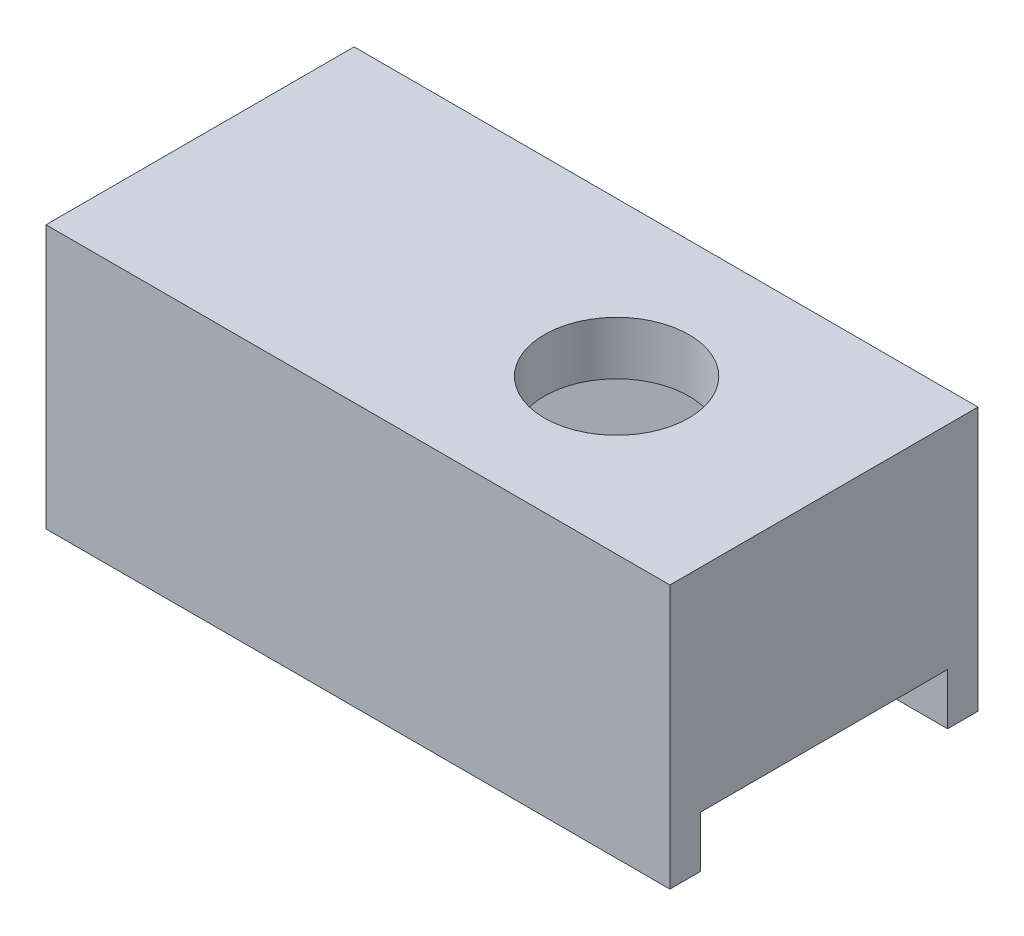
ISO-10303-21;
HEADER;
FILE_DESCRIPTION(('STEP AP214'),'2;1');
FILE_NAME('part.step','',(''),(''),'','','');
FILE_SCHEMA(('AUTOMOTIVE_DESIGN { 1 0 10303 214 1 1 1 1 }'));
ENDSEC;
DATA;
#1=APPLICATION_CONTEXT('core data for automotive mechanical design processes');
#2=APPLICATION_PROTOCOL_DEFINITION('international standard','automotive_design',2000,#1);
#3=PRODUCT_CONTEXT('',#1,'mechanical');
#4=PRODUCT('Part','Part','',(#3));
#5=PRODUCT_RELATED_PRODUCT_CATEGORY('part','',(#4));
#6=PRODUCT_DEFINITION_FORMATION('','',#4);
#7=PRODUCT_DEFINITION_CONTEXT('part definition',#1,'design');
#8=PRODUCT_DEFINITION('design','',#6,#7);
#9=PRODUCT_DEFINITION_SHAPE('','',#8);
#10=(LENGTH_UNIT() NAMED_UNIT(*) SI_UNIT(.MILLI.,.METRE.));
#11=(NAMED_UNIT(*) PLANE_ANGLE_UNIT() SI_UNIT($,.RADIAN.));
#12=(NAMED_UNIT(*) SI_UNIT($,.STERADIAN.) SOLID_ANGLE_UNIT());
#13=UNCERTAINTY_MEASURE_WITH_UNIT(LENGTH_MEASURE(1.E-05),#10,'distance_accuracy_value','');
#14=(GEOMETRIC_REPRESENTATION_CONTEXT(3) GLOBAL_UNCERTAINTY_ASSIGNED_CONTEXT((#13)) GLOBAL_UNIT_ASSIGNED_CONTEXT((#10,
#11,#12)) REPRESENTATION_CONTEXT('',''));
#15=CARTESIAN_POINT('',(0.,0.,0.));
#16=DIRECTION('',(0.,0.,1.));
#17=DIRECTION('',(1.,0.,0.));
#18=AXIS2_PLACEMENT_3D('',#15,#16,#17);
#19=CARTESIAN_POINT('',(0.,7.85,0.));
#20=DIRECTION('',(0.,-1.,0.));
#21=DIRECTION('',(0.,0.,-1.));
#22=AXIS2_PLACEMENT_3D('',#19,#20,#21);
#23=PLANE('',#22);
#24=CARTESIAN_POINT('',(-13.75,7.85,0.));
#25=DIRECTION('',(0.,-1.,0.));
#26=DIRECTION('',(0.,0.,-1.));
#27=AXIS2_PLACEMENT_3D('',#24,#25,#26);
#28=CIRCLE('',#27,0.925);
#29=CARTESIAN_POINT('',(-13.75,7.85,-0.925));
#30=VERTEX_POINT('',#29);
#31=EDGE_CURVE('E43',#30,#30,#28,.T.);
#32=ORIENTED_EDGE('',*,*,#31,.F.);
#33=EDGE_LOOP('',(#32));
#34=FACE_BOUND('',#33,.T.);
#35=DIRECTION('',(0.,0.,1.));
#36=VECTOR('',#35,1.);
#37=CARTESIAN_POINT('',(-11.7,7.85,6.5));
#38=LINE('',#37,#36);
#39=CARTESIAN_POINT('',(-11.7,7.85,-6.5));
#40=VERTEX_POINT('',#39);
#41=CARTESIAN_POINT('',(-11.7,7.85,6.5));
#42=VERTEX_POINT('',#41);
#43=EDGE_CURVE('E134',#40,#42,#38,.T.);
#44=ORIENTED_EDGE('',*,*,#43,.T.);
#45=DIRECTION('',(1.,0.,0.));
#46=VECTOR('',#45,1.);
#47=CARTESIAN_POINT('',(-16.4,7.85,6.5));
#48=LINE('',#47,#46);
#49=CARTESIAN_POINT('',(-16.4,7.85,6.5));
#50=VERTEX_POINT('',#49);
#51=EDGE_CURVE('E147',#50,#42,#48,.T.);
#52=ORIENTED_EDGE('',*,*,#51,.F.);
#53=DIRECTION('',(0.,0.,1.));
#54=VECTOR('',#53,1.);
#55=CARTESIAN_POINT('',(-16.4,7.85,6.5));
#56=LINE('',#55,#54);
#57=CARTESIAN_POINT('',(-16.4,7.85,-6.5));
#58=VERTEX_POINT('',#57);
#59=EDGE_CURVE('E164',#58,#50,#56,.T.);
#60=ORIENTED_EDGE('',*,*,#59,.F.);
#61=DIRECTION('',(-1.,0.,0.));
#62=VECTOR('',#61,1.);
#63=CARTESIAN_POINT('',(-16.4,7.85,-6.5));
#64=LINE('',#63,#62);
#65=EDGE_CURVE('E149',#40,#58,#64,.T.);
#66=ORIENTED_EDGE('',*,*,#65,.F.);
#67=EDGE_LOOP('',(#44,#52,#60,#66));
#68=FACE_BOUND('',#67,.T.);
#69=ADVANCED_FACE('F39',(#34,#68),#23,.T.);
#70=CARTESIAN_POINT('',(0.,5.15,0.));
#71=DIRECTION('',(0.,-1.,0.));
#72=DIRECTION('',(0.,0.,-1.));
#73=AXIS2_PLACEMENT_3D('',#70,#71,#72);
#74=PLANE('',#73);
#75=DIRECTION('',(-1.,0.,0.));
#76=VECTOR('',#75,1.);
#77=CARTESIAN_POINT('',(-16.4,5.15,-6.5));
#78=LINE('',#77,#76);
#79=CARTESIAN_POINT('',(16.4,5.15,-6.5));
#80=VERTEX_POINT('',#79);
#81=CARTESIAN_POINT('',(-16.4,5.15,-6.5));
#82=VERTEX_POINT('',#81);
#83=EDGE_CURVE('E185',#80,#82,#78,.T.);
#84=ORIENTED_EDGE('',*,*,#83,.T.);
#85=DIRECTION('',(0.,0.,1.));
#86=VECTOR('',#85,1.);
#87=CARTESIAN_POINT('',(-16.4,5.15,8.1));
#88=LINE('',#87,#86);
#89=CARTESIAN_POINT('',(-16.4,5.15,-8.1));
#90=VERTEX_POINT('',#89);
#91=EDGE_CURVE('E201',#90,#82,#88,.T.);
#92=ORIENTED_EDGE('',*,*,#91,.F.);
#93=DIRECTION('',(-1.,0.,0.));
#94=VECTOR('',#93,1.);
#95=CARTESIAN_POINT('',(-16.4,5.15,-8.1));
#96=LINE('',#95,#94);
#97=CARTESIAN_POINT('',(16.4,5.15,-8.1));
#98=VERTEX_POINT('',#97);
#99=EDGE_CURVE('E191',#98,#90,#96,.T.);
#100=ORIENTED_EDGE('',*,*,#99,.F.);
#101=DIRECTION('',(0.,0.,-1.));
#102=VECTOR('',#101,1.);
#103=CARTESIAN_POINT('',(16.4,5.15,8.1));
#104=LINE('',#103,#102);
#105=EDGE_CURVE('E208',#80,#98,#104,.T.);
#106=ORIENTED_EDGE('',*,*,#105,.F.);
#107=EDGE_LOOP('',(#84,#92,#100,#106));
#108=FACE_BOUND('',#107,.T.);
#109=ADVANCED_FACE('F278',(#108),#74,.T.);
#110=CARTESIAN_POINT('',(-16.4,19.,8.1));
#111=DIRECTION('',(1.,0.,0.));
#112=DIRECTION('',(0.,0.,-1.));
#113=AXIS2_PLACEMENT_3D('',#110,#111,#112);
#114=PLANE('',#113);
#115=ORIENTED_EDGE('',*,*,#91,.T.);
#116=DIRECTION('',(0.,1.,0.));
#117=VECTOR('',#116,1.);
#118=CARTESIAN_POINT('',(-16.4,5.15,-6.5));
#119=LINE('',#118,#117);
#120=EDGE_CURVE('E173',#82,#58,#119,.T.);
#121=ORIENTED_EDGE('',*,*,#120,.T.);
#122=ORIENTED_EDGE('',*,*,#59,.T.);
#123=DIRECTION('',(0.,1.,0.));
#124=VECTOR('',#123,1.);
#125=CARTESIAN_POINT('',(-16.4,5.15,6.5));
#126=LINE('',#125,#124);
#127=CARTESIAN_POINT('',(-16.4,5.15,6.5));
#128=VERTEX_POINT('',#127);
#129=EDGE_CURVE('E155',#128,#50,#126,.T.);
#130=ORIENTED_EDGE('',*,*,#129,.F.);
#131=CARTESIAN_POINT('',(-16.4,5.15,8.1));
#132=VERTEX_POINT('',#131);
#133=EDGE_CURVE('E177',#128,#132,#88,.T.);
#134=ORIENTED_EDGE('',*,*,#133,.T.);
#135=DIRECTION('',(0.,-1.,0.));
#136=VECTOR('',#135,1.);
#137=CARTESIAN_POINT('',(-16.4,19.,8.1));
#138=LINE('',#137,#136);
#139=CARTESIAN_POINT('',(-16.4,19.,8.1));
#140=VERTEX_POINT('',#139);
#141=EDGE_CURVE('E11',#140,#132,#138,.T.);
#142=ORIENTED_EDGE('',*,*,#141,.F.);
#143=DIRECTION('',(0.,0.,1.));
#144=VECTOR('',#143,1.);
#145=CARTESIAN_POINT('',(-16.4,19.,8.1));
#146=LINE('',#145,#144);
#147=CARTESIAN_POINT('',(-16.4,19.,-8.1));
#148=VERTEX_POINT('',#147);
#149=EDGE_CURVE('E186',#148,#140,#146,.T.);
#150=ORIENTED_EDGE('',*,*,#149,.F.);
#151=DIRECTION('',(0.,-1.,0.));
#152=VECTOR('',#151,1.);
#153=CARTESIAN_POINT('',(-16.4,19.,-8.1));
#154=LINE('',#153,#152);
#155=EDGE_CURVE('E200',#148,#90,#154,.T.);
#156=ORIENTED_EDGE('',*,*,#155,.T.);
#157=EDGE_LOOP('',(#115,#121,#122,#130,#134,#142,#150,#156));
#158=FACE_BOUND('',#157,.T.);
#159=ADVANCED_FACE('F41',(#158),#114,.F.);
#160=CARTESIAN_POINT('',(-16.4,19.,8.1));
#161=DIRECTION('',(0.,0.,-1.));
#162=DIRECTION('',(-1.,0.,0.));
#163=AXIS2_PLACEMENT_3D('',#160,#161,#162);
#164=PLANE('',#163);
#165=DIRECTION('',(1.,0.,0.));
#166=VECTOR('',#165,1.);
#167=CARTESIAN_POINT('',(-16.4,5.15,8.1));
#168=LINE('',#167,#166);
#169=CARTESIAN_POINT('',(16.4,5.15,8.1));
#170=VERTEX_POINT('',#169);
#171=EDGE_CURVE('E205',#132,#170,#168,.T.);
#172=ORIENTED_EDGE('',*,*,#171,.T.);
#173=DIRECTION('',(0.,-1.,0.));
#174=VECTOR('',#173,1.);
#175=CARTESIAN_POINT('',(16.4,19.,8.1));
#176=LINE('',#175,#174);
#177=CARTESIAN_POINT('',(16.4,19.,8.1));
#178=VERTEX_POINT('',#177);
#179=EDGE_CURVE('E49',#178,#170,#176,.T.);
#180=ORIENTED_EDGE('',*,*,#179,.F.);
#181=DIRECTION('',(1.,0.,0.));
#182=VECTOR('',#181,1.);
#183=CARTESIAN_POINT('',(-16.4,19.,8.1));
#184=LINE('',#183,#182);
#185=EDGE_CURVE('E190',#140,#178,#184,.T.);
#186=ORIENTED_EDGE('',*,*,#185,.F.);
#187=ORIENTED_EDGE('',*,*,#141,.T.);
#188=EDGE_LOOP('',(#172,#180,#186,#187));
#189=FACE_BOUND('',#188,.T.);
#190=ADVANCED_FACE('F302',(#189),#164,.F.);
#191=CARTESIAN_POINT('',(16.4,19.,8.1));
#192=DIRECTION('',(-1.,0.,0.));
#193=DIRECTION('',(0.,0.,1.));
#194=AXIS2_PLACEMENT_3D('',#191,#192,#193);
#195=PLANE('',#194);
#196=DIRECTION('',(0.,0.,-1.));
#197=VECTOR('',#196,1.);
#198=CARTESIAN_POINT('',(16.4,7.85,6.5));
#199=LINE('',#198,#197);
#200=CARTESIAN_POINT('',(16.4,7.85,6.5));
#201=VERTEX_POINT('',#200);
#202=CARTESIAN_POINT('',(16.4,7.85,-6.5));
#203=VERTEX_POINT('',#202);
#204=EDGE_CURVE('E157',#201,#203,#199,.T.);
#205=ORIENTED_EDGE('',*,*,#204,.T.);
#206=DIRECTION('',(0.,1.,0.));
#207=VECTOR('',#206,1.);
#208=CARTESIAN_POINT('',(16.4,5.15,-6.5));
#209=LINE('',#208,#207);
#210=EDGE_CURVE('E178',#80,#203,#209,.T.);
#211=ORIENTED_EDGE('',*,*,#210,.F.);
#212=ORIENTED_EDGE('',*,*,#105,.T.);
#213=DIRECTION('',(0.,-1.,0.));
#214=VECTOR('',#213,1.);
#215=CARTESIAN_POINT('',(16.4,19.,-8.1));
#216=LINE('',#215,#214);
#217=CARTESIAN_POINT('',(16.4,19.,-8.1));
#218=VERTEX_POINT('',#217);
#219=EDGE_CURVE('E218',#218,#98,#216,.T.);
#220=ORIENTED_EDGE('',*,*,#219,.F.);
#221=DIRECTION('',(0.,0.,-1.));
#222=VECTOR('',#221,1.);
#223=CARTESIAN_POINT('',(16.4,19.,8.1));
#224=LINE('',#223,#222);
#225=EDGE_CURVE('E194',#178,#218,#224,.T.);
#226=ORIENTED_EDGE('',*,*,#225,.F.);
#227=ORIENTED_EDGE('',*,*,#179,.T.);
#228=CARTESIAN_POINT('',(16.4,5.15,6.5));
#229=VERTEX_POINT('',#228);
#230=EDGE_CURVE('E209',#170,#229,#104,.T.);
#231=ORIENTED_EDGE('',*,*,#230,.T.);
#232=DIRECTION('',(0.,1.,0.));
#233=VECTOR('',#232,1.);
#234=CARTESIAN_POINT('',(16.4,5.15,6.5));
#235=LINE('',#234,#233);
#236=EDGE_CURVE('E65',#229,#201,#235,.T.);
#237=ORIENTED_EDGE('',*,*,#236,.T.);
#238=EDGE_LOOP('',(#205,#211,#212,#220,#226,#227,#231,#237));
#239=FACE_BOUND('',#238,.T.);
#240=ADVANCED_FACE('F292',(#239),#195,.F.);
#241=CARTESIAN_POINT('',(-16.4,19.,-8.1));
#242=DIRECTION('',(0.,0.,1.));
#243=DIRECTION('',(1.,0.,0.));
#244=AXIS2_PLACEMENT_3D('',#241,#242,#243);
#245=PLANE('',#244);
#246=ORIENTED_EDGE('',*,*,#99,.T.);
#247=ORIENTED_EDGE('',*,*,#155,.F.);
#248=DIRECTION('',(-1.,0.,0.));
#249=VECTOR('',#248,1.);
#250=CARTESIAN_POINT('',(-16.4,19.,-8.1));
#251=LINE('',#250,#249);
#252=EDGE_CURVE('E197',#218,#148,#251,.T.);
#253=ORIENTED_EDGE('',*,*,#252,.F.);
#254=ORIENTED_EDGE('',*,*,#219,.T.);
#255=EDGE_LOOP('',(#246,#247,#253,#254));
#256=FACE_BOUND('',#255,.T.);
#257=ADVANCED_FACE('F288',(#256),#245,.F.);
#258=CARTESIAN_POINT('',(0.,19.,0.));
#259=DIRECTION('',(0.,-1.,0.));
#260=DIRECTION('',(0.,0.,-1.));
#261=AXIS2_PLACEMENT_3D('',#258,#259,#260);
#262=PLANE('',#261);
#263=CARTESIAN_POINT('',(5.5,19.,0.));
#264=DIRECTION('',(0.,1.,0.));
#265=DIRECTION('',(0.,0.,1.));
#266=AXIS2_PLACEMENT_3D('',#263,#264,#265);
#267=CIRCLE('',#266,3.8);
#268=CARTESIAN_POINT('',(5.5,19.,3.8));
#269=VERTEX_POINT('',#268);
#270=EDGE_CURVE('E233',#269,#269,#267,.T.);
#271=ORIENTED_EDGE('',*,*,#270,.F.);
#272=EDGE_LOOP('',(#271));
#273=FACE_BOUND('',#272,.T.);
#274=ORIENTED_EDGE('',*,*,#149,.T.);
#275=ORIENTED_EDGE('',*,*,#185,.T.);
#276=ORIENTED_EDGE('',*,*,#225,.T.);
#277=ORIENTED_EDGE('',*,*,#252,.T.);
#278=EDGE_LOOP('',(#274,#275,#276,#277));
#279=FACE_BOUND('',#278,.T.);
#280=ADVANCED_FACE('F304',(#273,#279),#262,.F.);
#281=DIRECTION('',(1.,0.,0.));
#282=VECTOR('',#281,1.);
#283=CARTESIAN_POINT('',(-16.4,5.15,6.5));
#284=LINE('',#283,#282);
#285=EDGE_CURVE('E172',#128,#229,#284,.T.);
#286=ORIENTED_EDGE('',*,*,#285,.T.);
#287=ORIENTED_EDGE('',*,*,#230,.F.);
#288=ORIENTED_EDGE('',*,*,#171,.F.);
#289=ORIENTED_EDGE('',*,*,#133,.F.);
#290=EDGE_LOOP('',(#286,#287,#288,#289));
#291=FACE_BOUND('',#290,.T.);
#292=ADVANCED_FACE('F299',(#291),#74,.T.);
#293=CARTESIAN_POINT('',(-16.4,5.15,-6.5));
#294=DIRECTION('',(0.,0.,-1.));
#295=DIRECTION('',(-1.,0.,0.));
#296=AXIS2_PLACEMENT_3D('',#293,#294,#295);
#297=PLANE('',#296);
#298=CARTESIAN_POINT('',(11.7,7.85,-6.5));
#299=VERTEX_POINT('',#298);
#300=EDGE_CURVE('E168',#203,#299,#64,.T.);
#301=ORIENTED_EDGE('',*,*,#300,.T.);
#302=DIRECTION('',(0.,1.,0.));
#303=VECTOR('',#302,1.);
#304=CARTESIAN_POINT('',(11.7,7.85,-6.5));
#305=LINE('',#304,#303);
#306=CARTESIAN_POINT('',(11.7,16.2,-6.5));
#307=VERTEX_POINT('',#306);
#308=EDGE_CURVE('E267',#299,#307,#305,.T.);
#309=ORIENTED_EDGE('',*,*,#308,.T.);
#310=DIRECTION('',(-1.,0.,0.));
#311=VECTOR('',#310,1.);
#312=CARTESIAN_POINT('',(-11.7,16.2,-6.5));
#313=LINE('',#312,#311);
#314=CARTESIAN_POINT('',(-11.7,16.2,-6.5));
#315=VERTEX_POINT('',#314);
#316=EDGE_CURVE('E151',#307,#315,#313,.T.);
#317=ORIENTED_EDGE('',*,*,#316,.T.);
#318=DIRECTION('',(0.,1.,0.));
#319=VECTOR('',#318,1.);
#320=CARTESIAN_POINT('',(-11.7,7.85,-6.5));
#321=LINE('',#320,#319);
#322=EDGE_CURVE('E264',#40,#315,#321,.T.);
#323=ORIENTED_EDGE('',*,*,#322,.F.);
#324=ORIENTED_EDGE('',*,*,#65,.T.);
#325=ORIENTED_EDGE('',*,*,#120,.F.);
#326=ORIENTED_EDGE('',*,*,#83,.F.);
#327=ORIENTED_EDGE('',*,*,#210,.T.);
#328=EDGE_LOOP('',(#301,#309,#317,#323,#324,#325,#326,#327));
#329=FACE_BOUND('',#328,.T.);
#330=ADVANCED_FACE('F312',(#329),#297,.F.);
#331=CARTESIAN_POINT('',(-16.4,5.15,6.5));
#332=DIRECTION('',(0.,0.,1.));
#333=DIRECTION('',(1.,0.,0.));
#334=AXIS2_PLACEMENT_3D('',#331,#332,#333);
#335=PLANE('',#334);
#336=ORIENTED_EDGE('',*,*,#51,.T.);
#337=DIRECTION('',(0.,1.,0.));
#338=VECTOR('',#337,1.);
#339=CARTESIAN_POINT('',(-11.7,7.85,6.5));
#340=LINE('',#339,#338);
#341=CARTESIAN_POINT('',(-11.7,16.2,6.5));
#342=VERTEX_POINT('',#341);
#343=EDGE_CURVE('E131',#42,#342,#340,.T.);
#344=ORIENTED_EDGE('',*,*,#343,.T.);
#345=DIRECTION('',(1.,0.,0.));
#346=VECTOR('',#345,1.);
#347=CARTESIAN_POINT('',(-11.7,16.2,6.5));
#348=LINE('',#347,#346);
#349=CARTESIAN_POINT('',(11.7,16.2,6.5));
#350=VERTEX_POINT('',#349);
#351=EDGE_CURVE('E254',#342,#350,#348,.T.);
#352=ORIENTED_EDGE('',*,*,#351,.T.);
#353=DIRECTION('',(0.,1.,0.));
#354=VECTOR('',#353,1.);
#355=CARTESIAN_POINT('',(11.7,7.85,6.5));
#356=LINE('',#355,#354);
#357=CARTESIAN_POINT('',(11.7,7.85,6.5));
#358=VERTEX_POINT('',#357);
#359=EDGE_CURVE('E142',#358,#350,#356,.T.);
#360=ORIENTED_EDGE('',*,*,#359,.F.);
#361=EDGE_CURVE('E158',#358,#201,#48,.T.);
#362=ORIENTED_EDGE('',*,*,#361,.T.);
#363=ORIENTED_EDGE('',*,*,#236,.F.);
#364=ORIENTED_EDGE('',*,*,#285,.F.);
#365=ORIENTED_EDGE('',*,*,#129,.T.);
#366=EDGE_LOOP('',(#336,#344,#352,#360,#362,#363,#364,#365));
#367=FACE_BOUND('',#366,.T.);
#368=ADVANCED_FACE('F153',(#367),#335,.F.);
#369=CARTESIAN_POINT('',(13.75,7.85,0.));
#370=DIRECTION('',(0.,-1.,0.));
#371=DIRECTION('',(0.,0.,-1.));
#372=AXIS2_PLACEMENT_3D('',#369,#370,#371);
#373=CIRCLE('',#372,0.925);
#374=CARTESIAN_POINT('',(13.75,7.85,-0.925));
#375=VERTEX_POINT('',#374);
#376=EDGE_CURVE('E224',#375,#375,#373,.T.);
#377=ORIENTED_EDGE('',*,*,#376,.F.);
#378=EDGE_LOOP('',(#377));
#379=FACE_BOUND('',#378,.T.);
#380=DIRECTION('',(0.,0.,-1.));
#381=VECTOR('',#380,1.);
#382=CARTESIAN_POINT('',(11.7,7.85,6.5));
#383=LINE('',#382,#381);
#384=EDGE_CURVE('E57',#358,#299,#383,.T.);
#385=ORIENTED_EDGE('',*,*,#384,.T.);
#386=ORIENTED_EDGE('',*,*,#300,.F.);
#387=ORIENTED_EDGE('',*,*,#204,.F.);
#388=ORIENTED_EDGE('',*,*,#361,.F.);
#389=EDGE_LOOP('',(#385,#386,#387,#388));
#390=FACE_BOUND('',#389,.T.);
#391=ADVANCED_FACE('F320',(#379,#390),#23,.T.);
#392=CARTESIAN_POINT('',(-11.7,7.85,6.5));
#393=DIRECTION('',(-1.,0.,0.));
#394=DIRECTION('',(0.,0.,1.));
#395=AXIS2_PLACEMENT_3D('',#392,#393,#394);
#396=PLANE('',#395);
#397=DIRECTION('',(0.,0.,1.));
#398=VECTOR('',#397,1.);
#399=CARTESIAN_POINT('',(-11.7,16.2,6.5));
#400=LINE('',#399,#398);
#401=EDGE_CURVE('E137',#315,#342,#400,.T.);
#402=ORIENTED_EDGE('',*,*,#401,.T.);
#403=ORIENTED_EDGE('',*,*,#343,.F.);
#404=ORIENTED_EDGE('',*,*,#43,.F.);
#405=ORIENTED_EDGE('',*,*,#322,.T.);
#406=EDGE_LOOP('',(#402,#403,#404,#405));
#407=FACE_BOUND('',#406,.T.);
#408=ADVANCED_FACE('F133',(#407),#396,.F.);
#409=CARTESIAN_POINT('',(11.7,7.85,6.5));
#410=DIRECTION('',(1.,0.,0.));
#411=DIRECTION('',(0.,0.,-1.));
#412=AXIS2_PLACEMENT_3D('',#409,#410,#411);
#413=PLANE('',#412);
#414=DIRECTION('',(0.,0.,-1.));
#415=VECTOR('',#414,1.);
#416=CARTESIAN_POINT('',(11.7,16.2,6.5));
#417=LINE('',#416,#415);
#418=EDGE_CURVE('E257',#350,#307,#417,.T.);
#419=ORIENTED_EDGE('',*,*,#418,.T.);
#420=ORIENTED_EDGE('',*,*,#308,.F.);
#421=ORIENTED_EDGE('',*,*,#384,.F.);
#422=ORIENTED_EDGE('',*,*,#359,.T.);
#423=EDGE_LOOP('',(#419,#420,#421,#422));
#424=FACE_BOUND('',#423,.T.);
#425=ADVANCED_FACE('F333',(#424),#413,.F.);
#426=CARTESIAN_POINT('',(0.,16.2,0.));
#427=DIRECTION('',(0.,-1.,0.));
#428=DIRECTION('',(0.,0.,-1.));
#429=AXIS2_PLACEMENT_3D('',#426,#427,#428);
#430=PLANE('',#429);
#431=CARTESIAN_POINT('',(5.5,16.2,0.));
#432=DIRECTION('',(0.,1.,0.));
#433=DIRECTION('',(0.,0.,1.));
#434=AXIS2_PLACEMENT_3D('',#431,#432,#433);
#435=CIRCLE('',#434,3.8);
#436=CARTESIAN_POINT('',(5.5,16.2,3.8));
#437=VERTEX_POINT('',#436);
#438=EDGE_CURVE('E243',#437,#437,#435,.T.);
#439=ORIENTED_EDGE('',*,*,#438,.T.);
#440=EDGE_LOOP('',(#439));
#441=FACE_BOUND('',#440,.T.);
#442=ORIENTED_EDGE('',*,*,#401,.F.);
#443=ORIENTED_EDGE('',*,*,#316,.F.);
#444=ORIENTED_EDGE('',*,*,#418,.F.);
#445=ORIENTED_EDGE('',*,*,#351,.F.);
#446=EDGE_LOOP('',(#442,#443,#444,#445));
#447=FACE_BOUND('',#446,.T.);
#448=ADVANCED_FACE('F341',(#441,#447),#430,.T.);
#449=CARTESIAN_POINT('',(5.5,16.2,0.));
#450=DIRECTION('',(0.,1.,0.));
#451=DIRECTION('',(0.,0.,1.));
#452=AXIS2_PLACEMENT_3D('',#449,#450,#451);
#453=CYLINDRICAL_SURFACE('',#452,3.8);
#454=ORIENTED_EDGE('',*,*,#438,.F.);
#455=EDGE_LOOP('',(#454));
#456=FACE_BOUND('',#455,.T.);
#457=ORIENTED_EDGE('',*,*,#270,.T.);
#458=EDGE_LOOP('',(#457));
#459=FACE_BOUND('',#458,.T.);
#460=ADVANCED_FACE('F343',(#456,#459),#453,.F.);
#461=CARTESIAN_POINT('',(13.75,7.83,0.));
#462=DIRECTION('',(0.,1.,0.));
#463=DIRECTION('',(0.,0.,1.));
#464=AXIS2_PLACEMENT_3D('',#461,#462,#463);
#465=CYLINDRICAL_SURFACE('',#464,0.925);
#466=ORIENTED_EDGE('',*,*,#376,.T.);
#467=EDGE_LOOP('',(#466));
#468=FACE_BOUND('',#467,.T.);
#469=CARTESIAN_POINT('',(13.75,15.85,0.));
#470=DIRECTION('',(0.,1.,0.));
#471=DIRECTION('',(0.,0.,1.));
#472=AXIS2_PLACEMENT_3D('',#469,#470,#471);
#473=CIRCLE('',#472,0.925);
#474=CARTESIAN_POINT('',(13.75,15.85,0.925));
#475=VERTEX_POINT('',#474);
#476=EDGE_CURVE('E235',#475,#475,#473,.T.);
#477=ORIENTED_EDGE('',*,*,#476,.T.);
#478=EDGE_LOOP('',(#477));
#479=FACE_BOUND('',#478,.T.);
#480=ADVANCED_FACE('F350',(#468,#479),#465,.F.);
#481=CARTESIAN_POINT('',(13.75,15.85,0.));
#482=DIRECTION('',(0.,1.,0.));
#483=DIRECTION('',(0.,0.,1.));
#484=AXIS2_PLACEMENT_3D('',#481,#482,#483);
#485=PLANE('',#484);
#486=ORIENTED_EDGE('',*,*,#476,.F.);
#487=EDGE_LOOP('',(#486));
#488=FACE_BOUND('',#487,.T.);
#489=ADVANCED_FACE('F357',(#488),#485,.F.);
#490=CARTESIAN_POINT('',(-13.75,7.83,0.));
#491=DIRECTION('',(0.,1.,0.));
#492=DIRECTION('',(0.,0.,1.));
#493=AXIS2_PLACEMENT_3D('',#490,#491,#492);
#494=CYLINDRICAL_SURFACE('',#493,0.925);
#495=ORIENTED_EDGE('',*,*,#31,.T.);
#496=EDGE_LOOP('',(#495));
#497=FACE_BOUND('',#496,.T.);
#498=CARTESIAN_POINT('',(-13.75,15.85,0.));
#499=DIRECTION('',(0.,1.,0.));
#500=DIRECTION('',(0.,0.,1.));
#501=AXIS2_PLACEMENT_3D('',#498,#499,#500);
#502=CIRCLE('',#501,0.925);
#503=CARTESIAN_POINT('',(-13.75,15.85,0.925));
#504=VERTEX_POINT('',#503);
#505=EDGE_CURVE('E227',#504,#504,#502,.T.);
#506=ORIENTED_EDGE('',*,*,#505,.T.);
#507=EDGE_LOOP('',(#506));
#508=FACE_BOUND('',#507,.T.);
#509=ADVANCED_FACE('F360',(#497,#508),#494,.F.);
#510=CARTESIAN_POINT('',(-13.75,15.85,0.));
#511=DIRECTION('',(0.,1.,0.));
#512=DIRECTION('',(0.,0.,1.));
#513=AXIS2_PLACEMENT_3D('',#510,#511,#512);
#514=PLANE('',#513);
#515=ORIENTED_EDGE('',*,*,#505,.F.);
#516=EDGE_LOOP('',(#515));
#517=FACE_BOUND('',#516,.T.);
#518=ADVANCED_FACE('F364',(#517),#514,.F.);
#519=CLOSED_SHELL('',(#69,#109,#159,#190,#240,#257,#280,#292,#330,#368,#391,#408,#425,#448,#460,
#480,#489,#509,#518));
#520=MANIFOLD_SOLID_BREP('B2',#519);
#521=ADVANCED_BREP_SHAPE_REPRESENTATION('',(#18,#520),#14);
#522=SHAPE_DEFINITION_REPRESENTATION(#9,#521);
ENDSEC;
END-ISO-10303-21;
